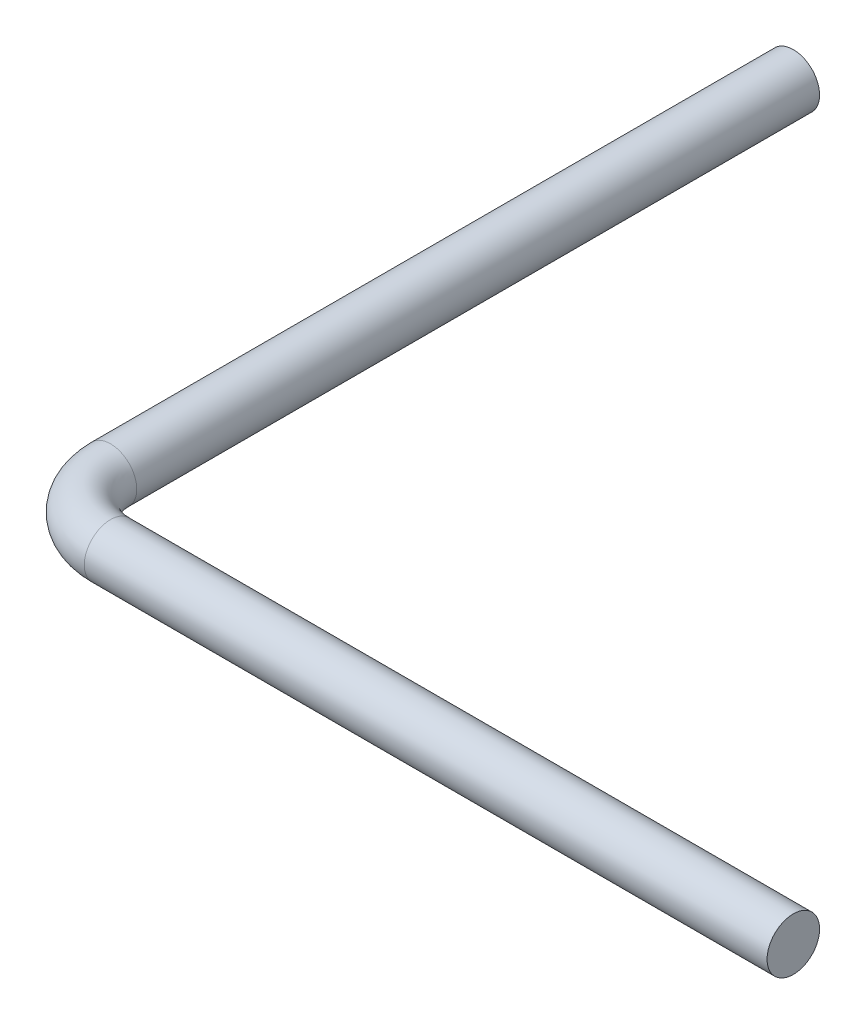
ISO-10303-21;
HEADER;
FILE_DESCRIPTION(('STEP AP214'),'2;1');
FILE_NAME('part.step','',(''),(''),'','','');
FILE_SCHEMA(('AUTOMOTIVE_DESIGN { 1 0 10303 214 1 1 1 1 }'));
ENDSEC;
DATA;
#1=APPLICATION_CONTEXT('core data for automotive mechanical design processes');
#2=APPLICATION_PROTOCOL_DEFINITION('international standard','automotive_design',2000,#1);
#3=PRODUCT_CONTEXT('',#1,'mechanical');
#4=PRODUCT('Part','Part','',(#3));
#5=PRODUCT_RELATED_PRODUCT_CATEGORY('part','',(#4));
#6=PRODUCT_DEFINITION_FORMATION('','',#4);
#7=PRODUCT_DEFINITION_CONTEXT('part definition',#1,'design');
#8=PRODUCT_DEFINITION('design','',#6,#7);
#9=PRODUCT_DEFINITION_SHAPE('','',#8);
#10=(LENGTH_UNIT() NAMED_UNIT(*) SI_UNIT(.MILLI.,.METRE.));
#11=(NAMED_UNIT(*) PLANE_ANGLE_UNIT() SI_UNIT($,.RADIAN.));
#12=(NAMED_UNIT(*) SI_UNIT($,.STERADIAN.) SOLID_ANGLE_UNIT());
#13=UNCERTAINTY_MEASURE_WITH_UNIT(LENGTH_MEASURE(1.E-05),#10,'distance_accuracy_value','');
#14=(GEOMETRIC_REPRESENTATION_CONTEXT(3) GLOBAL_UNCERTAINTY_ASSIGNED_CONTEXT((#13)) GLOBAL_UNIT_ASSIGNED_CONTEXT((#10,
#11,#12)) REPRESENTATION_CONTEXT('',''));
#15=CARTESIAN_POINT('',(0.,0.,0.));
#16=DIRECTION('',(0.,0.,1.));
#17=DIRECTION('',(1.,0.,0.));
#18=AXIS2_PLACEMENT_3D('',#15,#16,#17);
#19=CARTESIAN_POINT('',(0.,0.,50.));
#20=DIRECTION('',(0.,0.,-1.));
#21=DIRECTION('',(-1.,0.,0.));
#22=AXIS2_PLACEMENT_3D('',#19,#20,#21);
#23=CYLINDRICAL_SURFACE('',#22,2.);
#24=CARTESIAN_POINT('',(0.,0.,0.));
#25=DIRECTION('',(0.,0.,1.));
#26=DIRECTION('',(1.,0.,0.));
#27=AXIS2_PLACEMENT_3D('',#24,#25,#26);
#28=CIRCLE('',#27,2.);
#29=CARTESIAN_POINT('',(2.,0.,0.));
#30=VERTEX_POINT('',#29);
#31=EDGE_CURVE('E10',#30,#30,#28,.T.);
#32=ORIENTED_EDGE('',*,*,#31,.T.);
#33=EDGE_LOOP('',(#32));
#34=FACE_BOUND('',#33,.T.);
#35=CARTESIAN_POINT('',(0.,0.,52.));
#36=DIRECTION('',(0.,0.,1.));
#37=DIRECTION('',(1.,0.,0.));
#38=AXIS2_PLACEMENT_3D('',#35,#36,#37);
#39=CIRCLE('',#38,2.);
#40=CARTESIAN_POINT('',(-1.99999999999979,0.,52.));
#41=VERTEX_POINT('',#40);
#42=EDGE_CURVE('E51',#41,#41,#39,.T.);
#43=ORIENTED_EDGE('',*,*,#42,.F.);
#44=EDGE_LOOP('',(#43));
#45=FACE_BOUND('',#44,.T.);
#46=ADVANCED_FACE('F37',(#34,#45),#23,.T.);
#47=CARTESIAN_POINT('',(0.,0.,0.));
#48=DIRECTION('',(0.,0.,1.));
#49=DIRECTION('',(1.,0.,0.));
#50=AXIS2_PLACEMENT_3D('',#47,#48,#49);
#51=PLANE('',#50);
#52=ORIENTED_EDGE('',*,*,#31,.F.);
#53=EDGE_LOOP('',(#52));
#54=FACE_BOUND('',#53,.T.);
#55=ADVANCED_FACE('F60',(#54),#51,.F.);
#56=CARTESIAN_POINT('',(57.,0.,57.));
#57=DIRECTION('',(1.,0.,0.));
#58=DIRECTION('',(0.,0.,-1.));
#59=AXIS2_PLACEMENT_3D('',#56,#57,#58);
#60=PLANE('',#59);
#61=CARTESIAN_POINT('',(57.,0.,57.));
#62=DIRECTION('',(1.,0.,0.));
#63=DIRECTION('',(0.,0.,-1.));
#64=AXIS2_PLACEMENT_3D('',#61,#62,#63);
#65=CIRCLE('',#64,2.);
#66=CARTESIAN_POINT('',(57.,0.,55.));
#67=VERTEX_POINT('',#66);
#68=EDGE_CURVE('E43',#67,#67,#65,.T.);
#69=ORIENTED_EDGE('',*,*,#68,.T.);
#70=EDGE_LOOP('',(#69));
#71=FACE_BOUND('',#70,.T.);
#72=ADVANCED_FACE('F64',(#71),#60,.T.);
#73=CARTESIAN_POINT('',(5.,0.,52.));
#74=DIRECTION('',(0.,1.,0.));
#75=DIRECTION('',(0.,0.,1.));
#76=AXIS2_PLACEMENT_3D('',#73,#74,#75);
#77=TOROIDAL_SURFACE('',#76,4.99999999999979,2.);
#78=CARTESIAN_POINT('',(5.,0.,57.));
#79=DIRECTION('',(1.,0.,0.));
#80=DIRECTION('',(0.,0.,-1.));
#81=AXIS2_PLACEMENT_3D('',#78,#79,#80);
#82=CIRCLE('',#81,2.);
#83=CARTESIAN_POINT('',(5.00000000000001,0.,58.9999999999998));
#84=VERTEX_POINT('',#83);
#85=EDGE_CURVE('E47',#84,#84,#82,.T.);
#86=CARTESIAN_POINT('',(5.,0.,52.));
#87=DIRECTION('',(0.,1.,0.));
#88=DIRECTION('',(0.,0.,1.));
#89=AXIS2_PLACEMENT_3D('',#86,#87,#88);
#90=CIRCLE('',#89,6.99999999999979);
#91=EDGE_CURVE('',#41,#84,#90,.T.);
#92=ORIENTED_EDGE('',*,*,#42,.T.);
#93=ORIENTED_EDGE('',*,*,#85,.F.);
#94=ORIENTED_EDGE('',*,*,#91,.T.);
#95=ORIENTED_EDGE('',*,*,#91,.F.);
#96=EDGE_LOOP('',(#92,#94,#93,#95));
#97=FACE_BOUND('',#96,.T.);
#98=ADVANCED_FACE('F57',(#97),#77,.T.);
#99=CARTESIAN_POINT('',(5.,0.,57.));
#100=DIRECTION('',(1.,0.,0.));
#101=DIRECTION('',(0.,0.,-1.));
#102=AXIS2_PLACEMENT_3D('',#99,#100,#101);
#103=CYLINDRICAL_SURFACE('',#102,2.);
#104=ORIENTED_EDGE('',*,*,#68,.F.);
#105=EDGE_LOOP('',(#104));
#106=FACE_BOUND('',#105,.T.);
#107=ORIENTED_EDGE('',*,*,#85,.T.);
#108=EDGE_LOOP('',(#107));
#109=FACE_BOUND('',#108,.T.);
#110=ADVANCED_FACE('F66',(#106,#109),#103,.T.);
#111=CLOSED_SHELL('',(#46,#55,#72,#98,#110));
#112=MANIFOLD_SOLID_BREP('B2',#111);
#113=ADVANCED_BREP_SHAPE_REPRESENTATION('',(#18,#112),#14);
#114=SHAPE_DEFINITION_REPRESENTATION(#9,#113);
ENDSEC;
END-ISO-10303-21;
